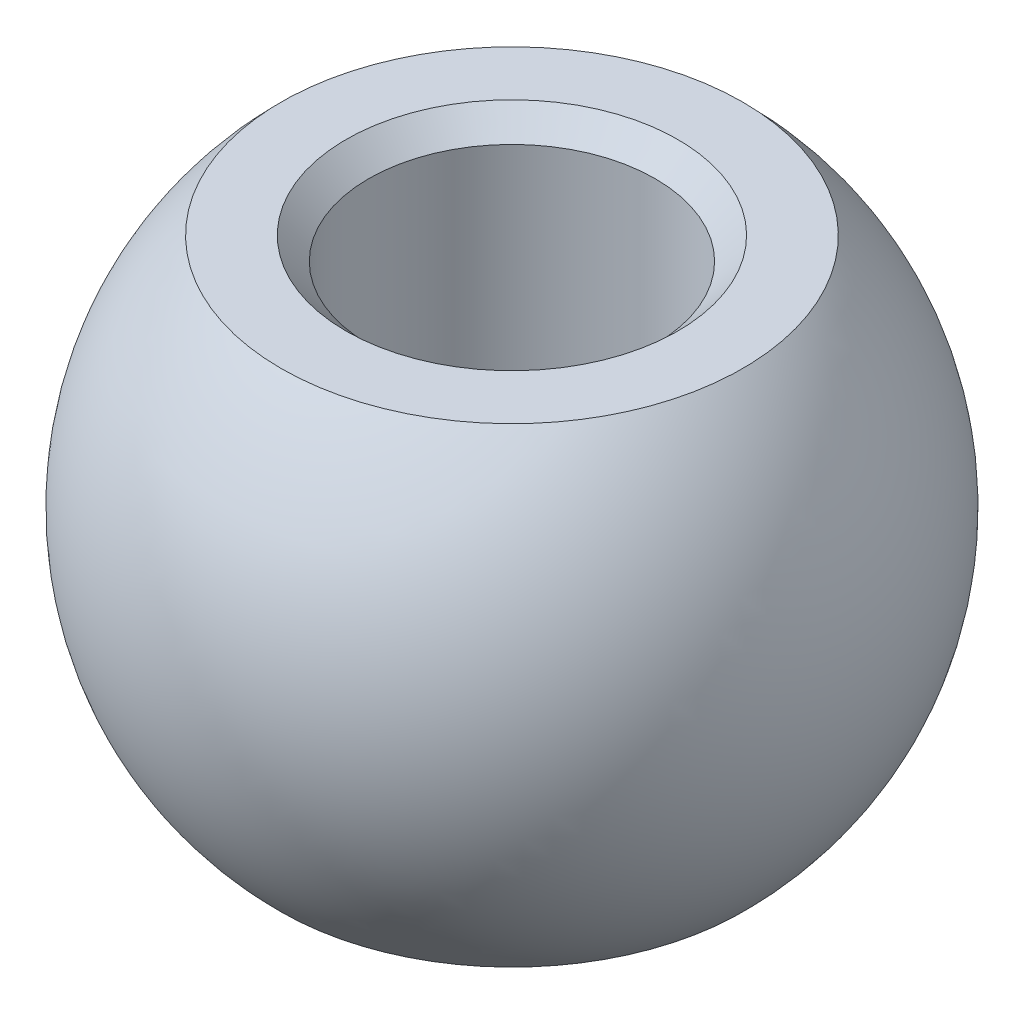
ISO-10303-21;
HEADER;
FILE_DESCRIPTION(('STEP AP214'),'2;1');
FILE_NAME('part.step','',(''),(''),'','','');
FILE_SCHEMA(('AUTOMOTIVE_DESIGN { 1 0 10303 214 1 1 1 1 }'));
ENDSEC;
DATA;
#1=APPLICATION_CONTEXT('core data for automotive mechanical design processes');
#2=APPLICATION_PROTOCOL_DEFINITION('international standard','automotive_design',2000,#1);
#3=PRODUCT_CONTEXT('',#1,'mechanical');
#4=PRODUCT('Part','Part','',(#3));
#5=PRODUCT_RELATED_PRODUCT_CATEGORY('part','',(#4));
#6=PRODUCT_DEFINITION_FORMATION('','',#4);
#7=PRODUCT_DEFINITION_CONTEXT('part definition',#1,'design');
#8=PRODUCT_DEFINITION('design','',#6,#7);
#9=PRODUCT_DEFINITION_SHAPE('','',#8);
#10=(LENGTH_UNIT() NAMED_UNIT(*) SI_UNIT(.MILLI.,.METRE.));
#11=(NAMED_UNIT(*) PLANE_ANGLE_UNIT() SI_UNIT($,.RADIAN.));
#12=(NAMED_UNIT(*) SI_UNIT($,.STERADIAN.) SOLID_ANGLE_UNIT());
#13=UNCERTAINTY_MEASURE_WITH_UNIT(LENGTH_MEASURE(1.E-05),#10,'distance_accuracy_value','');
#14=(GEOMETRIC_REPRESENTATION_CONTEXT(3) GLOBAL_UNCERTAINTY_ASSIGNED_CONTEXT((#13)) GLOBAL_UNIT_ASSIGNED_CONTEXT((#10,
#11,#12)) REPRESENTATION_CONTEXT('',''));
#15=CARTESIAN_POINT('',(0.,0.,0.));
#16=DIRECTION('',(0.,0.,1.));
#17=DIRECTION('',(1.,0.,0.));
#18=AXIS2_PLACEMENT_3D('',#15,#16,#17);
#19=CARTESIAN_POINT('',(2.413,0.,0.));
#20=DIRECTION('',(0.,-1.,0.));
#21=DIRECTION('',(0.,0.,-1.));
#22=AXIS2_PLACEMENT_3D('',#19,#20,#21);
#23=PLANE('',#22);
#24=CARTESIAN_POINT('',(0.,0.,0.));
#25=DIRECTION('',(0.,-1.,0.));
#26=DIRECTION('',(0.,0.,-1.));
#27=AXIS2_PLACEMENT_3D('',#24,#25,#26);
#28=CIRCLE('',#27,2.794);
#29=CARTESIAN_POINT('',(0.,0.,-2.794));
#30=VERTEX_POINT('',#29);
#31=EDGE_CURVE('E51',#30,#30,#28,.F.);
#32=ORIENTED_EDGE('',*,*,#31,.T.);
#33=EDGE_LOOP('',(#32));
#34=FACE_BOUND('',#33,.T.);
#35=CARTESIAN_POINT('',(0.,0.,0.));
#36=DIRECTION('',(0.,-1.,0.));
#37=DIRECTION('',(0.,0.,-1.));
#38=AXIS2_PLACEMENT_3D('',#35,#36,#37);
#39=CIRCLE('',#38,3.8862);
#40=CARTESIAN_POINT('',(0.,0.,-3.8862));
#41=VERTEX_POINT('',#40);
#42=EDGE_CURVE('E67',#41,#41,#39,.T.);
#43=ORIENTED_EDGE('',*,*,#42,.T.);
#44=EDGE_LOOP('',(#43));
#45=FACE_BOUND('',#44,.T.);
#46=ADVANCED_FACE('F43',(#34,#45),#23,.T.);
#47=CARTESIAN_POINT('',(0.,0.,0.));
#48=DIRECTION('',(0.,-1.,0.));
#49=DIRECTION('',(0.,0.,-1.));
#50=AXIS2_PLACEMENT_3D('',#47,#48,#49);
#51=CYLINDRICAL_SURFACE('',#50,2.413);
#52=CARTESIAN_POINT('',(0.,0.381000000000005,0.));
#53=DIRECTION('',(0.,-1.,0.));
#54=DIRECTION('',(0.,0.,-1.));
#55=AXIS2_PLACEMENT_3D('',#52,#53,#54);
#56=CIRCLE('',#55,2.413);
#57=CARTESIAN_POINT('',(0.,0.381000000000005,-2.413));
#58=VERTEX_POINT('',#57);
#59=EDGE_CURVE('E55',#58,#58,#56,.T.);
#60=ORIENTED_EDGE('',*,*,#59,.T.);
#61=EDGE_LOOP('',(#60));
#62=FACE_BOUND('',#61,.T.);
#63=CARTESIAN_POINT('',(0.,7.54379999999999,0.));
#64=DIRECTION('',(0.,1.,0.));
#65=DIRECTION('',(0.,0.,1.));
#66=AXIS2_PLACEMENT_3D('',#63,#64,#65);
#67=CIRCLE('',#66,2.413);
#68=CARTESIAN_POINT('',(0.,7.54379999999999,2.413));
#69=VERTEX_POINT('',#68);
#70=EDGE_CURVE('E59',#69,#69,#67,.T.);
#71=ORIENTED_EDGE('',*,*,#70,.T.);
#72=EDGE_LOOP('',(#71));
#73=FACE_BOUND('',#72,.T.);
#74=ADVANCED_FACE('F84',(#62,#73),#51,.F.);
#75=CARTESIAN_POINT('',(2.413,7.9248,0.));
#76=DIRECTION('',(0.,1.,0.));
#77=DIRECTION('',(0.,0.,1.));
#78=AXIS2_PLACEMENT_3D('',#75,#76,#77);
#79=PLANE('',#78);
#80=CARTESIAN_POINT('',(0.,7.9248,0.));
#81=DIRECTION('',(0.,1.,0.));
#82=DIRECTION('',(0.,0.,1.));
#83=AXIS2_PLACEMENT_3D('',#80,#81,#82);
#84=CIRCLE('',#83,2.794);
#85=CARTESIAN_POINT('',(0.,7.9248,2.794));
#86=VERTEX_POINT('',#85);
#87=EDGE_CURVE('E10',#86,#86,#84,.F.);
#88=ORIENTED_EDGE('',*,*,#87,.T.);
#89=EDGE_LOOP('',(#88));
#90=FACE_BOUND('',#89,.T.);
#91=CARTESIAN_POINT('',(0.,7.9248,0.));
#92=DIRECTION('',(0.,-1.,0.));
#93=DIRECTION('',(0.,0.,-1.));
#94=AXIS2_PLACEMENT_3D('',#91,#92,#93);
#95=CIRCLE('',#94,3.8862);
#96=CARTESIAN_POINT('',(0.,7.9248,-3.8862));
#97=VERTEX_POINT('',#96);
#98=EDGE_CURVE('E64',#97,#97,#95,.T.);
#99=ORIENTED_EDGE('',*,*,#98,.F.);
#100=EDGE_LOOP('',(#99));
#101=FACE_BOUND('',#100,.T.);
#102=ADVANCED_FACE('F75',(#90,#101),#79,.T.);
#103=CARTESIAN_POINT('',(0.,3.9624,0.));
#104=DIRECTION('',(0.,-1.,0.));
#105=DIRECTION('',(0.,0.,-1.));
#106=AXIS2_PLACEMENT_3D('',#103,#104,#105);
#107=DEGENERATE_TOROIDAL_SURFACE('',#106,0.000228274678262027,5.5499,.T.);
#108=ORIENTED_EDGE('',*,*,#98,.T.);
#109=EDGE_LOOP('',(#108));
#110=FACE_BOUND('',#109,.T.);
#111=ORIENTED_EDGE('',*,*,#42,.F.);
#112=EDGE_LOOP('',(#111));
#113=FACE_BOUND('',#112,.T.);
#114=ADVANCED_FACE('F72',(#110,#113),#107,.T.);
#115=CARTESIAN_POINT('',(0.,0.381000000000005,0.));
#116=DIRECTION('',(0.,-1.,0.));
#117=DIRECTION('',(0.,0.,-1.));
#118=AXIS2_PLACEMENT_3D('',#115,#116,#117);
#119=CONICAL_SURFACE('',#118,2.413,0.785398163397449);
#120=ORIENTED_EDGE('',*,*,#31,.F.);
#121=EDGE_LOOP('',(#120));
#122=FACE_BOUND('',#121,.T.);
#123=ORIENTED_EDGE('',*,*,#59,.F.);
#124=EDGE_LOOP('',(#123));
#125=FACE_BOUND('',#124,.T.);
#126=ADVANCED_FACE('F74',(#122,#125),#119,.F.);
#127=CARTESIAN_POINT('',(0.,7.9248,0.));
#128=DIRECTION('',(0.,1.,0.));
#129=DIRECTION('',(0.,0.,1.));
#130=AXIS2_PLACEMENT_3D('',#127,#128,#129);
#131=CONICAL_SURFACE('',#130,2.794,0.785398163397444);
#132=CARTESIAN_POINT('',(0.,7.54379999999999,2.413));
#133=CARTESIAN_POINT('',(0.,7.54776874999999,2.41696875));
#134=CARTESIAN_POINT('',(0.,7.55173749999999,2.4209375));
#135=CARTESIAN_POINT('',(0.,7.55967499999999,2.428875));
#136=CARTESIAN_POINT('',(0.,7.56364374999999,2.43284375));
#137=CARTESIAN_POINT('',(0.,7.57158124999999,2.44078125));
#138=CARTESIAN_POINT('',(0.,7.57554999999999,2.44475));
#139=CARTESIAN_POINT('',(0.,7.58348749999999,2.4526875));
#140=CARTESIAN_POINT('',(0.,7.58745624999999,2.45665625));
#141=CARTESIAN_POINT('',(0.,7.59539374999999,2.46459375));
#142=CARTESIAN_POINT('',(0.,7.59936249999999,2.4685625));
#143=CARTESIAN_POINT('',(0.,7.60729999999999,2.4765));
#144=CARTESIAN_POINT('',(0.,7.61126874999999,2.48046875));
#145=CARTESIAN_POINT('',(0.,7.61920624999999,2.48840625));
#146=CARTESIAN_POINT('',(0.,7.62317499999999,2.492375));
#147=CARTESIAN_POINT('',(0.,7.63111249999999,2.5003125));
#148=CARTESIAN_POINT('',(0.,7.63508124999999,2.50428125));
#149=CARTESIAN_POINT('',(0.,7.64301874999999,2.51221875));
#150=CARTESIAN_POINT('',(0.,7.64698749999999,2.5161875));
#151=CARTESIAN_POINT('',(0.,7.65492499999999,2.524125));
#152=CARTESIAN_POINT('',(0.,7.65889374999999,2.52809375));
#153=CARTESIAN_POINT('',(0.,7.66683124999999,2.53603125));
#154=CARTESIAN_POINT('',(0.,7.67079999999999,2.54));
#155=CARTESIAN_POINT('',(0.,7.67873749999999,2.5479375));
#156=CARTESIAN_POINT('',(0.,7.68270624999999,2.55190625));
#157=CARTESIAN_POINT('',(0.,7.69064375,2.55984375));
#158=CARTESIAN_POINT('',(0.,7.69461249999999,2.5638125));
#159=CARTESIAN_POINT('',(0.,7.70254999999999,2.57175));
#160=CARTESIAN_POINT('',(0.,7.70651875,2.57571875));
#161=CARTESIAN_POINT('',(0.,7.71445625,2.58365625));
#162=CARTESIAN_POINT('',(0.,7.71842499999999,2.587625));
#163=CARTESIAN_POINT('',(0.,7.7263625,2.5955625));
#164=CARTESIAN_POINT('',(0.,7.73033125,2.59953125));
#165=CARTESIAN_POINT('',(0.,7.73826875,2.60746875));
#166=CARTESIAN_POINT('',(0.,7.7422375,2.6114375));
#167=CARTESIAN_POINT('',(0.,7.750175,2.619375));
#168=CARTESIAN_POINT('',(0.,7.75414375,2.62334375));
#169=CARTESIAN_POINT('',(0.,7.76208125,2.63128125));
#170=CARTESIAN_POINT('',(0.,7.76605,2.63525));
#171=CARTESIAN_POINT('',(0.,7.7739875,2.6431875));
#172=CARTESIAN_POINT('',(0.,7.77795625,2.64715625));
#173=CARTESIAN_POINT('',(0.,7.78589375,2.65509375));
#174=CARTESIAN_POINT('',(0.,7.7898625,2.6590625));
#175=CARTESIAN_POINT('',(0.,7.7978,2.667));
#176=CARTESIAN_POINT('',(0.,7.80176875,2.67096875));
#177=CARTESIAN_POINT('',(0.,7.80970625,2.67890625));
#178=CARTESIAN_POINT('',(0.,7.813675,2.682875));
#179=CARTESIAN_POINT('',(0.,7.8216125,2.6908125));
#180=CARTESIAN_POINT('',(0.,7.82558125,2.69478125));
#181=CARTESIAN_POINT('',(0.,7.83351875,2.70271875));
#182=CARTESIAN_POINT('',(0.,7.8374875,2.7066875));
#183=CARTESIAN_POINT('',(0.,7.845425,2.714625));
#184=CARTESIAN_POINT('',(0.,7.84939375,2.71859375));
#185=CARTESIAN_POINT('',(0.,7.85733125,2.72653125));
#186=CARTESIAN_POINT('',(0.,7.8613,2.7305));
#187=CARTESIAN_POINT('',(0.,7.8692375,2.7384375));
#188=CARTESIAN_POINT('',(0.,7.87320625,2.74240625));
#189=CARTESIAN_POINT('',(0.,7.88114375,2.75034375));
#190=CARTESIAN_POINT('',(0.,7.8851125,2.7543125));
#191=CARTESIAN_POINT('',(0.,7.89305,2.76225));
#192=CARTESIAN_POINT('',(0.,7.89701875,2.76621875));
#193=CARTESIAN_POINT('',(0.,7.90495625,2.77415625));
#194=CARTESIAN_POINT('',(0.,7.908925,2.778125));
#195=CARTESIAN_POINT('',(0.,7.9168625,2.7860625));
#196=CARTESIAN_POINT('',(0.,7.92083125,2.79003125));
#197=CARTESIAN_POINT('',(0.,7.9248,2.794));
#198=B_SPLINE_CURVE_WITH_KNOTS('',3,(#132,#133,#134,#135,#136,#137,#138,#139,#140,#141,#142,
#143,#144,#145,#146,#147,#148,#149,#150,#151,#152,#153,#154,#155,#156,#157,#158,#159,#160,#161,
#162,#163,#164,#165,#166,#167,#168,#169,#170,#171,#172,#173,#174,#175,#176,#177,#178,#179,#180,
#181,#182,#183,#184,#185,#186,#187,#188,#189,#190,#191,#192,#193,#194,#195,#196,#197),
.UNSPECIFIED.,.F.,.F.,(4,2,2,2,2,2,2,2,2,2,2,2,2,2,2,2,2,2,2,2,2,2,2,2,2,2,2,2,2,2,2,2,4),(0.,
0.0168379802270049,0.0336759604540096,0.0505139406810148,0.0673519209080195,0.0841899011350247,
0.101027881362029,0.117865861589034,0.134703841816039,0.151541822043044,0.168379802270049,
0.185217782497054,0.202055762724058,0.218893742951064,0.235731723178068,0.252569703405073,
0.269407683632078,0.286245663859083,0.303083644086087,0.319921624313093,0.336759604540097,
0.353597584767103,0.370435564994107,0.387273545221112,0.404111525448117,0.420949505675121,
0.437787485902126,0.454625466129132,0.471463446356137,0.488301426583141,0.505139406810146,
0.521977387037151,0.538815367264156),.UNSPECIFIED.);
#199=EDGE_CURVE('BSEAM46',#69,#86,#198,.T.);
#200=ORIENTED_EDGE('',*,*,#70,.F.);
#201=ORIENTED_EDGE('',*,*,#87,.F.);
#202=ORIENTED_EDGE('',*,*,#199,.T.);
#203=ORIENTED_EDGE('',*,*,#199,.F.);
#204=EDGE_LOOP('',(#200,#202,#201,#203));
#205=FACE_BOUND('',#204,.T.);
#206=ADVANCED_FACE('F46',(#205),#131,.F.);
#207=CLOSED_SHELL('',(#46,#74,#102,#114,#126,#206));
#208=MANIFOLD_SOLID_BREP('B2',#207);
#209=ADVANCED_BREP_SHAPE_REPRESENTATION('',(#18,#208),#14);
#210=SHAPE_DEFINITION_REPRESENTATION(#9,#209);
ENDSEC;
END-ISO-10303-21;
